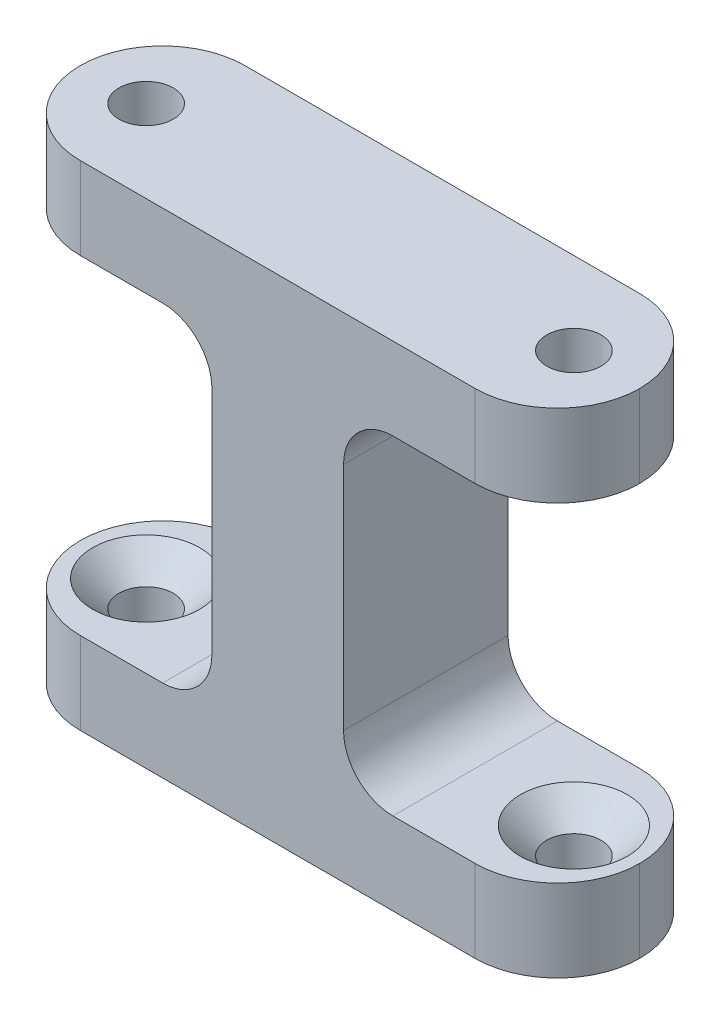
ISO-10303-21;
HEADER;
FILE_DESCRIPTION(('STEP AP214'),'2;1');
FILE_NAME('part.step','',(''),(''),'','','');
FILE_SCHEMA(('AUTOMOTIVE_DESIGN { 1 0 10303 214 1 1 1 1 }'));
ENDSEC;
DATA;
#1=APPLICATION_CONTEXT('core data for automotive mechanical design processes');
#2=APPLICATION_PROTOCOL_DEFINITION('international standard','automotive_design',2000,#1);
#3=PRODUCT_CONTEXT('',#1,'mechanical');
#4=PRODUCT('Part','Part','',(#3));
#5=PRODUCT_RELATED_PRODUCT_CATEGORY('part','',(#4));
#6=PRODUCT_DEFINITION_FORMATION('','',#4);
#7=PRODUCT_DEFINITION_CONTEXT('part definition',#1,'design');
#8=PRODUCT_DEFINITION('design','',#6,#7);
#9=PRODUCT_DEFINITION_SHAPE('','',#8);
#10=(LENGTH_UNIT() NAMED_UNIT(*) SI_UNIT(.MILLI.,.METRE.));
#11=(NAMED_UNIT(*) PLANE_ANGLE_UNIT() SI_UNIT($,.RADIAN.));
#12=(NAMED_UNIT(*) SI_UNIT($,.STERADIAN.) SOLID_ANGLE_UNIT());
#13=UNCERTAINTY_MEASURE_WITH_UNIT(LENGTH_MEASURE(1.E-05),#10,'distance_accuracy_value','');
#14=(GEOMETRIC_REPRESENTATION_CONTEXT(3) GLOBAL_UNCERTAINTY_ASSIGNED_CONTEXT((#13)) GLOBAL_UNIT_ASSIGNED_CONTEXT((#10,
#11,#12)) REPRESENTATION_CONTEXT('',''));
#15=CARTESIAN_POINT('',(0.,0.,0.));
#16=DIRECTION('',(0.,0.,1.));
#17=DIRECTION('',(1.,0.,0.));
#18=AXIS2_PLACEMENT_3D('',#15,#16,#17);
#19=CARTESIAN_POINT('',(-34.,0.,10.));
#20=DIRECTION('',(0.,1.,0.));
#21=DIRECTION('',(0.,0.,1.));
#22=AXIS2_PLACEMENT_3D('',#19,#20,#21);
#23=PLANE('',#22);
#24=CARTESIAN_POINT('',(-30.,0.,5.00000000000001));
#25=DIRECTION('',(0.,1.,0.));
#26=DIRECTION('',(-1.,0.,0.));
#27=AXIS2_PLACEMENT_3D('',#24,#25,#26);
#28=CIRCLE('',#27,1.65);
#29=CARTESIAN_POINT('',(-31.65,0.,5.00000000000001));
#30=VERTEX_POINT('',#29);
#31=EDGE_CURVE('E384',#30,#30,#28,.T.);
#32=ORIENTED_EDGE('',*,*,#31,.T.);
#33=EDGE_LOOP('',(#32));
#34=FACE_BOUND('',#33,.T.);
#35=CARTESIAN_POINT('',(-4.,0.,5.00000000000001));
#36=DIRECTION('',(0.,1.,0.));
#37=DIRECTION('',(-1.,0.,0.));
#38=AXIS2_PLACEMENT_3D('',#35,#36,#37);
#39=CIRCLE('',#38,1.65);
#40=CARTESIAN_POINT('',(-5.65,0.,5.00000000000001));
#41=VERTEX_POINT('',#40);
#42=EDGE_CURVE('E318',#41,#41,#39,.T.);
#43=ORIENTED_EDGE('',*,*,#42,.T.);
#44=EDGE_LOOP('',(#43));
#45=FACE_BOUND('',#44,.T.);
#46=CARTESIAN_POINT('',(-29.,0.,5.));
#47=DIRECTION('',(0.,1.,0.));
#48=DIRECTION('',(0.,0.,1.));
#49=AXIS2_PLACEMENT_3D('',#46,#47,#48);
#50=CIRCLE('',#49,5.);
#51=CARTESIAN_POINT('',(-29.,0.,10.));
#52=VERTEX_POINT('',#51);
#53=CARTESIAN_POINT('',(-34.,0.,5.));
#54=VERTEX_POINT('',#53);
#55=EDGE_CURVE('E273',#52,#54,#50,.F.);
#56=ORIENTED_EDGE('',*,*,#55,.T.);
#57=CARTESIAN_POINT('',(-29.,0.,5.));
#58=DIRECTION('',(0.,1.,0.));
#59=DIRECTION('',(0.,0.,1.));
#60=AXIS2_PLACEMENT_3D('',#57,#58,#59);
#61=CIRCLE('',#60,5.);
#62=CARTESIAN_POINT('',(-29.,0.,0.));
#63=VERTEX_POINT('',#62);
#64=EDGE_CURVE('E275',#54,#63,#61,.F.);
#65=ORIENTED_EDGE('',*,*,#64,.T.);
#66=DIRECTION('',(1.,0.,0.));
#67=VECTOR('',#66,1.);
#68=CARTESIAN_POINT('',(-34.,0.,0.));
#69=LINE('',#68,#67);
#70=CARTESIAN_POINT('',(-5.,0.,0.));
#71=VERTEX_POINT('',#70);
#72=EDGE_CURVE('E355',#63,#71,#69,.T.);
#73=ORIENTED_EDGE('',*,*,#72,.T.);
#74=CARTESIAN_POINT('',(-5.,0.,5.));
#75=DIRECTION('',(0.,1.,0.));
#76=DIRECTION('',(0.,0.,1.));
#77=AXIS2_PLACEMENT_3D('',#74,#75,#76);
#78=CIRCLE('',#77,5.);
#79=CARTESIAN_POINT('',(0.,0.,5.));
#80=VERTEX_POINT('',#79);
#81=EDGE_CURVE('E269',#71,#80,#78,.F.);
#82=ORIENTED_EDGE('',*,*,#81,.T.);
#83=CARTESIAN_POINT('',(-5.,0.,5.));
#84=DIRECTION('',(0.,1.,0.));
#85=DIRECTION('',(0.,0.,1.));
#86=AXIS2_PLACEMENT_3D('',#83,#84,#85);
#87=CIRCLE('',#86,5.);
#88=CARTESIAN_POINT('',(-5.,0.,10.));
#89=VERTEX_POINT('',#88);
#90=EDGE_CURVE('E271',#80,#89,#87,.F.);
#91=ORIENTED_EDGE('',*,*,#90,.T.);
#92=DIRECTION('',(1.,0.,0.));
#93=VECTOR('',#92,1.);
#94=CARTESIAN_POINT('',(-34.,0.,10.));
#95=LINE('',#94,#93);
#96=EDGE_CURVE('E220',#52,#89,#95,.T.);
#97=ORIENTED_EDGE('',*,*,#96,.F.);
#98=EDGE_LOOP('',(#56,#65,#73,#82,#91,#97));
#99=FACE_BOUND('',#98,.T.);
#100=ADVANCED_FACE('F38',(#34,#45,#99),#23,.F.);
#101=CARTESIAN_POINT('',(0.,5.00000000000001,10.));
#102=DIRECTION('',(0.,-1.,0.));
#103=DIRECTION('',(1.,0.,0.));
#104=AXIS2_PLACEMENT_3D('',#101,#102,#103);
#105=PLANE('',#104);
#106=CARTESIAN_POINT('',(-4.,5.00000000000001,5.00000000000001));
#107=DIRECTION('',(0.,-1.,0.));
#108=DIRECTION('',(1.,0.,0.));
#109=AXIS2_PLACEMENT_3D('',#106,#107,#108);
#110=CIRCLE('',#109,3.25);
#111=CARTESIAN_POINT('',(-0.75,5.00000000000001,5.00000000000001));
#112=VERTEX_POINT('',#111);
#113=EDGE_CURVE('E233',#112,#112,#110,.T.);
#114=ORIENTED_EDGE('',*,*,#113,.T.);
#115=EDGE_LOOP('',(#114));
#116=FACE_BOUND('',#115,.T.);
#117=DIRECTION('',(-1.,0.,0.));
#118=VECTOR('',#117,1.);
#119=CARTESIAN_POINT('',(0.,5.00000000000001,10.));
#120=LINE('',#119,#118);
#121=CARTESIAN_POINT('',(-5.,5.,10.));
#122=VERTEX_POINT('',#121);
#123=CARTESIAN_POINT('',(-10.,5.,10.));
#124=VERTEX_POINT('',#123);
#125=EDGE_CURVE('E370',#122,#124,#120,.T.);
#126=ORIENTED_EDGE('',*,*,#125,.F.);
#127=CARTESIAN_POINT('',(-5.,5.,5.));
#128=DIRECTION('',(0.,-1.,0.));
#129=DIRECTION('',(1.,0.,0.));
#130=AXIS2_PLACEMENT_3D('',#127,#128,#129);
#131=CIRCLE('',#130,5.);
#132=CARTESIAN_POINT('',(0.,5.00000000000001,5.));
#133=VERTEX_POINT('',#132);
#134=EDGE_CURVE('E301',#122,#133,#131,.F.);
#135=ORIENTED_EDGE('',*,*,#134,.T.);
#136=CARTESIAN_POINT('',(-5.,5.,5.));
#137=DIRECTION('',(0.,-1.,0.));
#138=DIRECTION('',(1.,0.,0.));
#139=AXIS2_PLACEMENT_3D('',#136,#137,#138);
#140=CIRCLE('',#139,5.);
#141=CARTESIAN_POINT('',(-5.,5.,0.));
#142=VERTEX_POINT('',#141);
#143=EDGE_CURVE('E299',#133,#142,#140,.F.);
#144=ORIENTED_EDGE('',*,*,#143,.T.);
#145=DIRECTION('',(-1.,0.,0.));
#146=VECTOR('',#145,1.);
#147=CARTESIAN_POINT('',(0.,5.00000000000001,0.));
#148=LINE('',#147,#146);
#149=CARTESIAN_POINT('',(-10.,5.,0.));
#150=VERTEX_POINT('',#149);
#151=EDGE_CURVE('E209',#142,#150,#148,.T.);
#152=ORIENTED_EDGE('',*,*,#151,.T.);
#153=DIRECTION('',(0.,0.,-1.));
#154=VECTOR('',#153,1.);
#155=CARTESIAN_POINT('',(-10.,5.,10.));
#156=LINE('',#155,#154);
#157=EDGE_CURVE('E187',#150,#124,#156,.F.);
#158=ORIENTED_EDGE('',*,*,#157,.T.);
#159=EDGE_LOOP('',(#126,#135,#144,#152,#158));
#160=FACE_BOUND('',#159,.T.);
#161=ADVANCED_FACE('F360',(#116,#160),#105,.F.);
#162=CARTESIAN_POINT('',(-13.,5.,10.));
#163=DIRECTION('',(-1.,0.,0.));
#164=DIRECTION('',(0.,0.,1.));
#165=AXIS2_PLACEMENT_3D('',#162,#163,#164);
#166=PLANE('',#165);
#167=DIRECTION('',(0.,1.,0.));
#168=VECTOR('',#167,1.);
#169=CARTESIAN_POINT('',(-13.,5.,0.));
#170=LINE('',#169,#168);
#171=CARTESIAN_POINT('',(-13.,8.,0.));
#172=VERTEX_POINT('',#171);
#173=CARTESIAN_POINT('',(-13.,22.,0.));
#174=VERTEX_POINT('',#173);
#175=EDGE_CURVE('E204',#172,#174,#170,.T.);
#176=ORIENTED_EDGE('',*,*,#175,.T.);
#177=DIRECTION('',(0.,0.,-1.));
#178=VECTOR('',#177,1.);
#179=CARTESIAN_POINT('',(-13.,22.,10.));
#180=LINE('',#179,#178);
#181=CARTESIAN_POINT('',(-13.,22.,10.));
#182=VERTEX_POINT('',#181);
#183=EDGE_CURVE('E181',#174,#182,#180,.F.);
#184=ORIENTED_EDGE('',*,*,#183,.T.);
#185=DIRECTION('',(0.,1.,0.));
#186=VECTOR('',#185,1.);
#187=CARTESIAN_POINT('',(-13.,5.,10.));
#188=LINE('',#187,#186);
#189=CARTESIAN_POINT('',(-13.,8.,10.));
#190=VERTEX_POINT('',#189);
#191=EDGE_CURVE('E348',#190,#182,#188,.T.);
#192=ORIENTED_EDGE('',*,*,#191,.F.);
#193=DIRECTION('',(0.,0.,-1.));
#194=VECTOR('',#193,1.);
#195=CARTESIAN_POINT('',(-13.,8.,0.));
#196=LINE('',#195,#194);
#197=EDGE_CURVE('E194',#190,#172,#196,.T.);
#198=ORIENTED_EDGE('',*,*,#197,.T.);
#199=EDGE_LOOP('',(#176,#184,#192,#198));
#200=FACE_BOUND('',#199,.T.);
#201=ADVANCED_FACE('F372',(#200),#166,.F.);
#202=CARTESIAN_POINT('',(-13.,25.,10.));
#203=DIRECTION('',(0.,1.,0.));
#204=DIRECTION('',(-1.,0.,0.));
#205=AXIS2_PLACEMENT_3D('',#202,#203,#204);
#206=PLANE('',#205);
#207=CARTESIAN_POINT('',(-4.,25.,5.00000000000001));
#208=DIRECTION('',(0.,1.,0.));
#209=DIRECTION('',(-1.,0.,0.));
#210=AXIS2_PLACEMENT_3D('',#207,#208,#209);
#211=CIRCLE('',#210,1.65);
#212=CARTESIAN_POINT('',(-5.65,25.,5.00000000000001));
#213=VERTEX_POINT('',#212);
#214=EDGE_CURVE('E224',#213,#213,#211,.T.);
#215=ORIENTED_EDGE('',*,*,#214,.T.);
#216=EDGE_LOOP('',(#215));
#217=FACE_BOUND('',#216,.T.);
#218=DIRECTION('',(1.,0.,0.));
#219=VECTOR('',#218,1.);
#220=CARTESIAN_POINT('',(-13.,25.,0.));
#221=LINE('',#220,#219);
#222=CARTESIAN_POINT('',(-10.,25.,0.));
#223=VERTEX_POINT('',#222);
#224=CARTESIAN_POINT('',(-5.,25.,0.));
#225=VERTEX_POINT('',#224);
#226=EDGE_CURVE('E191',#223,#225,#221,.T.);
#227=ORIENTED_EDGE('',*,*,#226,.T.);
#228=CARTESIAN_POINT('',(-5.,25.,5.));
#229=DIRECTION('',(0.,1.,0.));
#230=DIRECTION('',(-1.,0.,0.));
#231=AXIS2_PLACEMENT_3D('',#228,#229,#230);
#232=CIRCLE('',#231,5.);
#233=CARTESIAN_POINT('',(0.,25.,5.));
#234=VERTEX_POINT('',#233);
#235=EDGE_CURVE('E61',#225,#234,#232,.F.);
#236=ORIENTED_EDGE('',*,*,#235,.T.);
#237=CARTESIAN_POINT('',(-5.,25.,5.));
#238=DIRECTION('',(0.,1.,0.));
#239=DIRECTION('',(-1.,0.,0.));
#240=AXIS2_PLACEMENT_3D('',#237,#238,#239);
#241=CIRCLE('',#240,5.);
#242=CARTESIAN_POINT('',(-5.,25.,10.));
#243=VERTEX_POINT('',#242);
#244=EDGE_CURVE('E311',#234,#243,#241,.F.);
#245=ORIENTED_EDGE('',*,*,#244,.T.);
#246=DIRECTION('',(1.,0.,0.));
#247=VECTOR('',#246,1.);
#248=CARTESIAN_POINT('',(-13.,25.,10.));
#249=LINE('',#248,#247);
#250=CARTESIAN_POINT('',(-10.,25.,10.));
#251=VERTEX_POINT('',#250);
#252=EDGE_CURVE('E193',#251,#243,#249,.T.);
#253=ORIENTED_EDGE('',*,*,#252,.F.);
#254=DIRECTION('',(0.,0.,-1.));
#255=VECTOR('',#254,1.);
#256=CARTESIAN_POINT('',(-10.,25.,0.));
#257=LINE('',#256,#255);
#258=EDGE_CURVE('E180',#251,#223,#257,.T.);
#259=ORIENTED_EDGE('',*,*,#258,.T.);
#260=EDGE_LOOP('',(#227,#236,#245,#253,#259));
#261=FACE_BOUND('',#260,.T.);
#262=ADVANCED_FACE('F190',(#217,#261),#206,.F.);
#263=CARTESIAN_POINT('',(0.,30.,10.));
#264=DIRECTION('',(0.,-1.,0.));
#265=DIRECTION('',(1.,0.,0.));
#266=AXIS2_PLACEMENT_3D('',#263,#264,#265);
#267=PLANE('',#266);
#268=CARTESIAN_POINT('',(-30.,30.,5.00000000000001));
#269=DIRECTION('',(0.,-1.,0.));
#270=DIRECTION('',(1.,0.,0.));
#271=AXIS2_PLACEMENT_3D('',#268,#269,#270);
#272=CIRCLE('',#271,1.65);
#273=CARTESIAN_POINT('',(-28.35,30.,5.00000000000001));
#274=VERTEX_POINT('',#273);
#275=EDGE_CURVE('E225',#274,#274,#272,.T.);
#276=ORIENTED_EDGE('',*,*,#275,.T.);
#277=EDGE_LOOP('',(#276));
#278=FACE_BOUND('',#277,.T.);
#279=CARTESIAN_POINT('',(-4.,30.,5.00000000000001));
#280=DIRECTION('',(0.,-1.,0.));
#281=DIRECTION('',(1.,0.,0.));
#282=AXIS2_PLACEMENT_3D('',#279,#280,#281);
#283=CIRCLE('',#282,1.65);
#284=CARTESIAN_POINT('',(-2.35,30.,5.00000000000001));
#285=VERTEX_POINT('',#284);
#286=EDGE_CURVE('E221',#285,#285,#283,.T.);
#287=ORIENTED_EDGE('',*,*,#286,.T.);
#288=EDGE_LOOP('',(#287));
#289=FACE_BOUND('',#288,.T.);
#290=CARTESIAN_POINT('',(-5.,30.,5.));
#291=DIRECTION('',(0.,-1.,0.));
#292=DIRECTION('',(1.,0.,0.));
#293=AXIS2_PLACEMENT_3D('',#290,#291,#292);
#294=CIRCLE('',#293,5.);
#295=CARTESIAN_POINT('',(-5.,30.,10.));
#296=VERTEX_POINT('',#295);
#297=CARTESIAN_POINT('',(0.,30.,5.));
#298=VERTEX_POINT('',#297);
#299=EDGE_CURVE('E307',#296,#298,#294,.F.);
#300=ORIENTED_EDGE('',*,*,#299,.T.);
#301=CARTESIAN_POINT('',(-5.,30.,5.));
#302=DIRECTION('',(0.,-1.,0.));
#303=DIRECTION('',(1.,0.,0.));
#304=AXIS2_PLACEMENT_3D('',#301,#302,#303);
#305=CIRCLE('',#304,5.);
#306=CARTESIAN_POINT('',(-5.,30.,0.));
#307=VERTEX_POINT('',#306);
#308=EDGE_CURVE('E309',#298,#307,#305,.F.);
#309=ORIENTED_EDGE('',*,*,#308,.T.);
#310=DIRECTION('',(-1.,0.,0.));
#311=VECTOR('',#310,1.);
#312=CARTESIAN_POINT('',(0.,30.,0.));
#313=LINE('',#312,#311);
#314=CARTESIAN_POINT('',(-29.,30.,0.));
#315=VERTEX_POINT('',#314);
#316=EDGE_CURVE('E203',#307,#315,#313,.T.);
#317=ORIENTED_EDGE('',*,*,#316,.T.);
#318=CARTESIAN_POINT('',(-29.,30.,5.));
#319=DIRECTION('',(0.,-1.,0.));
#320=DIRECTION('',(1.,0.,0.));
#321=AXIS2_PLACEMENT_3D('',#318,#319,#320);
#322=CIRCLE('',#321,5.);
#323=CARTESIAN_POINT('',(-34.,30.,5.));
#324=VERTEX_POINT('',#323);
#325=EDGE_CURVE('E305',#315,#324,#322,.F.);
#326=ORIENTED_EDGE('',*,*,#325,.T.);
#327=CARTESIAN_POINT('',(-29.,30.,5.));
#328=DIRECTION('',(0.,-1.,0.));
#329=DIRECTION('',(1.,0.,0.));
#330=AXIS2_PLACEMENT_3D('',#327,#328,#329);
#331=CIRCLE('',#330,5.);
#332=CARTESIAN_POINT('',(-29.,30.,10.));
#333=VERTEX_POINT('',#332);
#334=EDGE_CURVE('E303',#324,#333,#331,.F.);
#335=ORIENTED_EDGE('',*,*,#334,.T.);
#336=DIRECTION('',(-1.,0.,0.));
#337=VECTOR('',#336,1.);
#338=CARTESIAN_POINT('',(0.,30.,10.));
#339=LINE('',#338,#337);
#340=EDGE_CURVE('E338',#296,#333,#339,.T.);
#341=ORIENTED_EDGE('',*,*,#340,.F.);
#342=EDGE_LOOP('',(#300,#309,#317,#326,#335,#341));
#343=FACE_BOUND('',#342,.T.);
#344=ADVANCED_FACE('F337',(#278,#289,#343),#267,.F.);
#345=CARTESIAN_POINT('',(-34.,25.,10.));
#346=DIRECTION('',(0.,1.,0.));
#347=DIRECTION('',(0.,0.,1.));
#348=AXIS2_PLACEMENT_3D('',#345,#346,#347);
#349=PLANE('',#348);
#350=CARTESIAN_POINT('',(-30.,25.,5.00000000000001));
#351=DIRECTION('',(0.,1.,0.));
#352=DIRECTION('',(0.,0.,1.));
#353=AXIS2_PLACEMENT_3D('',#350,#351,#352);
#354=CIRCLE('',#353,1.65);
#355=CARTESIAN_POINT('',(-30.,25.,6.65000000000001));
#356=VERTEX_POINT('',#355);
#357=EDGE_CURVE('E381',#356,#356,#354,.T.);
#358=ORIENTED_EDGE('',*,*,#357,.T.);
#359=EDGE_LOOP('',(#358));
#360=FACE_BOUND('',#359,.T.);
#361=CARTESIAN_POINT('',(-29.,25.,5.));
#362=DIRECTION('',(0.,1.,0.));
#363=DIRECTION('',(0.,0.,1.));
#364=AXIS2_PLACEMENT_3D('',#361,#362,#363);
#365=CIRCLE('',#364,5.);
#366=CARTESIAN_POINT('',(-29.,25.,10.));
#367=VERTEX_POINT('',#366);
#368=CARTESIAN_POINT('',(-34.,25.,5.));
#369=VERTEX_POINT('',#368);
#370=EDGE_CURVE('E47',#367,#369,#365,.F.);
#371=ORIENTED_EDGE('',*,*,#370,.T.);
#372=CARTESIAN_POINT('',(-29.,25.,5.));
#373=DIRECTION('',(0.,1.,0.));
#374=DIRECTION('',(0.,0.,1.));
#375=AXIS2_PLACEMENT_3D('',#372,#373,#374);
#376=CIRCLE('',#375,5.);
#377=CARTESIAN_POINT('',(-29.,25.,0.));
#378=VERTEX_POINT('',#377);
#379=EDGE_CURVE('E11',#369,#378,#376,.F.);
#380=ORIENTED_EDGE('',*,*,#379,.T.);
#381=DIRECTION('',(1.,0.,0.));
#382=VECTOR('',#381,1.);
#383=CARTESIAN_POINT('',(-34.,25.,0.));
#384=LINE('',#383,#382);
#385=CARTESIAN_POINT('',(-24.,25.,0.));
#386=VERTEX_POINT('',#385);
#387=EDGE_CURVE('E207',#378,#386,#384,.T.);
#388=ORIENTED_EDGE('',*,*,#387,.T.);
#389=DIRECTION('',(0.,0.,-1.));
#390=VECTOR('',#389,1.);
#391=CARTESIAN_POINT('',(-24.,25.,10.));
#392=LINE('',#391,#390);
#393=CARTESIAN_POINT('',(-24.,25.,10.));
#394=VERTEX_POINT('',#393);
#395=EDGE_CURVE('E246',#386,#394,#392,.F.);
#396=ORIENTED_EDGE('',*,*,#395,.T.);
#397=DIRECTION('',(1.,0.,0.));
#398=VECTOR('',#397,1.);
#399=CARTESIAN_POINT('',(-34.,25.,10.));
#400=LINE('',#399,#398);
#401=EDGE_CURVE('E344',#367,#394,#400,.T.);
#402=ORIENTED_EDGE('',*,*,#401,.F.);
#403=EDGE_LOOP('',(#371,#380,#388,#396,#402));
#404=FACE_BOUND('',#403,.T.);
#405=ADVANCED_FACE('F605',(#360,#404),#349,.F.);
#406=CARTESIAN_POINT('',(-21.,25.,10.));
#407=DIRECTION('',(1.,0.,0.));
#408=DIRECTION('',(0.,1.,0.));
#409=AXIS2_PLACEMENT_3D('',#406,#407,#408);
#410=PLANE('',#409);
#411=DIRECTION('',(0.,-1.,0.));
#412=VECTOR('',#411,1.);
#413=CARTESIAN_POINT('',(-21.,25.,10.));
#414=LINE('',#413,#412);
#415=CARTESIAN_POINT('',(-21.,22.,10.));
#416=VERTEX_POINT('',#415);
#417=CARTESIAN_POINT('',(-21.,8.,10.));
#418=VERTEX_POINT('',#417);
#419=EDGE_CURVE('E346',#416,#418,#414,.T.);
#420=ORIENTED_EDGE('',*,*,#419,.F.);
#421=DIRECTION('',(0.,0.,-1.));
#422=VECTOR('',#421,1.);
#423=CARTESIAN_POINT('',(-21.,22.,0.));
#424=LINE('',#423,#422);
#425=CARTESIAN_POINT('',(-21.,22.,0.));
#426=VERTEX_POINT('',#425);
#427=EDGE_CURVE('E243',#416,#426,#424,.T.);
#428=ORIENTED_EDGE('',*,*,#427,.T.);
#429=DIRECTION('',(0.,-1.,0.));
#430=VECTOR('',#429,1.);
#431=CARTESIAN_POINT('',(-21.,25.,0.));
#432=LINE('',#431,#430);
#433=CARTESIAN_POINT('',(-21.,8.,0.));
#434=VERTEX_POINT('',#433);
#435=EDGE_CURVE('E214',#426,#434,#432,.T.);
#436=ORIENTED_EDGE('',*,*,#435,.T.);
#437=DIRECTION('',(0.,0.,-1.));
#438=VECTOR('',#437,1.);
#439=CARTESIAN_POINT('',(-21.,8.,10.));
#440=LINE('',#439,#438);
#441=EDGE_CURVE('E241',#434,#418,#440,.F.);
#442=ORIENTED_EDGE('',*,*,#441,.T.);
#443=EDGE_LOOP('',(#420,#428,#436,#442));
#444=FACE_BOUND('',#443,.T.);
#445=ADVANCED_FACE('F596',(#444),#410,.F.);
#446=CARTESIAN_POINT('',(-21.,5.,10.));
#447=DIRECTION('',(0.,-1.,0.));
#448=DIRECTION('',(1.,0.,0.));
#449=AXIS2_PLACEMENT_3D('',#446,#447,#448);
#450=PLANE('',#449);
#451=CARTESIAN_POINT('',(-30.,5.,5.00000000000001));
#452=DIRECTION('',(0.,-1.,0.));
#453=DIRECTION('',(1.,0.,0.));
#454=AXIS2_PLACEMENT_3D('',#451,#452,#453);
#455=CIRCLE('',#454,3.25);
#456=CARTESIAN_POINT('',(-26.75,5.,5.00000000000001));
#457=VERTEX_POINT('',#456);
#458=EDGE_CURVE('E226',#457,#457,#455,.T.);
#459=ORIENTED_EDGE('',*,*,#458,.T.);
#460=EDGE_LOOP('',(#459));
#461=FACE_BOUND('',#460,.T.);
#462=DIRECTION('',(-1.,0.,0.));
#463=VECTOR('',#462,1.);
#464=CARTESIAN_POINT('',(-21.,5.,0.));
#465=LINE('',#464,#463);
#466=CARTESIAN_POINT('',(-24.,5.,0.));
#467=VERTEX_POINT('',#466);
#468=CARTESIAN_POINT('',(-29.,5.,0.));
#469=VERTEX_POINT('',#468);
#470=EDGE_CURVE('E217',#467,#469,#465,.T.);
#471=ORIENTED_EDGE('',*,*,#470,.T.);
#472=CARTESIAN_POINT('',(-29.,5.,5.));
#473=DIRECTION('',(0.,-1.,0.));
#474=DIRECTION('',(1.,0.,0.));
#475=AXIS2_PLACEMENT_3D('',#472,#473,#474);
#476=CIRCLE('',#475,5.);
#477=CARTESIAN_POINT('',(-34.,5.,5.));
#478=VERTEX_POINT('',#477);
#479=EDGE_CURVE('E288',#469,#478,#476,.F.);
#480=ORIENTED_EDGE('',*,*,#479,.T.);
#481=CARTESIAN_POINT('',(-29.,5.,5.));
#482=DIRECTION('',(0.,-1.,0.));
#483=DIRECTION('',(1.,0.,0.));
#484=AXIS2_PLACEMENT_3D('',#481,#482,#483);
#485=CIRCLE('',#484,5.);
#486=CARTESIAN_POINT('',(-29.,5.,10.));
#487=VERTEX_POINT('',#486);
#488=EDGE_CURVE('E286',#478,#487,#485,.F.);
#489=ORIENTED_EDGE('',*,*,#488,.T.);
#490=DIRECTION('',(-1.,0.,0.));
#491=VECTOR('',#490,1.);
#492=CARTESIAN_POINT('',(-21.,5.,10.));
#493=LINE('',#492,#491);
#494=CARTESIAN_POINT('',(-24.,5.,10.));
#495=VERTEX_POINT('',#494);
#496=EDGE_CURVE('E230',#495,#487,#493,.T.);
#497=ORIENTED_EDGE('',*,*,#496,.F.);
#498=DIRECTION('',(0.,0.,-1.));
#499=VECTOR('',#498,1.);
#500=CARTESIAN_POINT('',(-24.,5.,0.));
#501=LINE('',#500,#499);
#502=EDGE_CURVE('E249',#495,#467,#501,.T.);
#503=ORIENTED_EDGE('',*,*,#502,.T.);
#504=EDGE_LOOP('',(#471,#480,#489,#497,#503));
#505=FACE_BOUND('',#504,.T.);
#506=ADVANCED_FACE('F588',(#461,#505),#450,.F.);
#507=CARTESIAN_POINT('',(0.,0.,10.));
#508=DIRECTION('',(0.,0.,1.));
#509=DIRECTION('',(1.,0.,0.));
#510=AXIS2_PLACEMENT_3D('',#507,#508,#509);
#511=PLANE('',#510);
#512=ORIENTED_EDGE('',*,*,#496,.T.);
#513=DIRECTION('',(0.,-1.,0.));
#514=VECTOR('',#513,1.);
#515=CARTESIAN_POINT('',(-29.,0.,10.));
#516=LINE('',#515,#514);
#517=EDGE_CURVE('E297',#487,#52,#516,.T.);
#518=ORIENTED_EDGE('',*,*,#517,.T.);
#519=ORIENTED_EDGE('',*,*,#96,.T.);
#520=DIRECTION('',(0.,1.,0.));
#521=VECTOR('',#520,1.);
#522=CARTESIAN_POINT('',(-5.,5.00000000000001,10.));
#523=LINE('',#522,#521);
#524=EDGE_CURVE('E294',#89,#122,#523,.T.);
#525=ORIENTED_EDGE('',*,*,#524,.T.);
#526=ORIENTED_EDGE('',*,*,#125,.T.);
#527=CARTESIAN_POINT('',(-10.,8.,10.));
#528=DIRECTION('',(0.,0.,1.));
#529=DIRECTION('',(1.,0.,0.));
#530=AXIS2_PLACEMENT_3D('',#527,#528,#529);
#531=CIRCLE('',#530,3.);
#532=EDGE_CURVE('E267',#124,#190,#531,.F.);
#533=ORIENTED_EDGE('',*,*,#532,.T.);
#534=ORIENTED_EDGE('',*,*,#191,.T.);
#535=CARTESIAN_POINT('',(-10.,22.,10.));
#536=DIRECTION('',(0.,0.,1.));
#537=DIRECTION('',(1.,0.,0.));
#538=AXIS2_PLACEMENT_3D('',#535,#536,#537);
#539=CIRCLE('',#538,3.);
#540=EDGE_CURVE('E186',#182,#251,#539,.F.);
#541=ORIENTED_EDGE('',*,*,#540,.T.);
#542=ORIENTED_EDGE('',*,*,#252,.T.);
#543=DIRECTION('',(0.,1.,0.));
#544=VECTOR('',#543,1.);
#545=CARTESIAN_POINT('',(-5.,30.,10.));
#546=LINE('',#545,#544);
#547=EDGE_CURVE('E292',#243,#296,#546,.T.);
#548=ORIENTED_EDGE('',*,*,#547,.T.);
#549=ORIENTED_EDGE('',*,*,#340,.T.);
#550=DIRECTION('',(0.,-1.,0.));
#551=VECTOR('',#550,1.);
#552=CARTESIAN_POINT('',(-29.,25.,10.));
#553=LINE('',#552,#551);
#554=EDGE_CURVE('E290',#333,#367,#553,.T.);
#555=ORIENTED_EDGE('',*,*,#554,.T.);
#556=ORIENTED_EDGE('',*,*,#401,.T.);
#557=CARTESIAN_POINT('',(-24.,22.,10.));
#558=DIRECTION('',(0.,0.,1.));
#559=DIRECTION('',(1.,0.,0.));
#560=AXIS2_PLACEMENT_3D('',#557,#558,#559);
#561=CIRCLE('',#560,3.);
#562=EDGE_CURVE('E258',#394,#416,#561,.F.);
#563=ORIENTED_EDGE('',*,*,#562,.T.);
#564=ORIENTED_EDGE('',*,*,#419,.T.);
#565=CARTESIAN_POINT('',(-24.,8.,10.));
#566=DIRECTION('',(0.,0.,1.));
#567=DIRECTION('',(1.,0.,0.));
#568=AXIS2_PLACEMENT_3D('',#565,#566,#567);
#569=CIRCLE('',#568,3.);
#570=EDGE_CURVE('E262',#418,#495,#569,.F.);
#571=ORIENTED_EDGE('',*,*,#570,.T.);
#572=EDGE_LOOP('',(#512,#518,#519,#525,#526,#533,#534,#541,#542,#548,#549,#555,#556,#563,#564,#571));
#573=FACE_BOUND('',#572,.T.);
#574=ADVANCED_FACE('F342',(#573),#511,.T.);
#575=CARTESIAN_POINT('',(0.,0.,0.));
#576=DIRECTION('',(0.,0.,1.));
#577=DIRECTION('',(1.,0.,0.));
#578=AXIS2_PLACEMENT_3D('',#575,#576,#577);
#579=PLANE('',#578);
#580=ORIENTED_EDGE('',*,*,#72,.F.);
#581=DIRECTION('',(0.,-1.,0.));
#582=VECTOR('',#581,1.);
#583=CARTESIAN_POINT('',(-29.,0.,0.));
#584=LINE('',#583,#582);
#585=EDGE_CURVE('E283',#63,#469,#584,.F.);
#586=ORIENTED_EDGE('',*,*,#585,.T.);
#587=ORIENTED_EDGE('',*,*,#470,.F.);
#588=CARTESIAN_POINT('',(-24.,8.,0.));
#589=DIRECTION('',(0.,0.,1.));
#590=DIRECTION('',(1.,0.,0.));
#591=AXIS2_PLACEMENT_3D('',#588,#589,#590);
#592=CIRCLE('',#591,3.);
#593=EDGE_CURVE('E260',#467,#434,#592,.T.);
#594=ORIENTED_EDGE('',*,*,#593,.T.);
#595=ORIENTED_EDGE('',*,*,#435,.F.);
#596=CARTESIAN_POINT('',(-24.,22.,0.));
#597=DIRECTION('',(0.,0.,1.));
#598=DIRECTION('',(1.,0.,0.));
#599=AXIS2_PLACEMENT_3D('',#596,#597,#598);
#600=CIRCLE('',#599,3.);
#601=EDGE_CURVE('E255',#426,#386,#600,.T.);
#602=ORIENTED_EDGE('',*,*,#601,.T.);
#603=ORIENTED_EDGE('',*,*,#387,.F.);
#604=DIRECTION('',(0.,-1.,0.));
#605=VECTOR('',#604,1.);
#606=CARTESIAN_POINT('',(-29.,0.,0.));
#607=LINE('',#606,#605);
#608=EDGE_CURVE('E277',#378,#315,#607,.F.);
#609=ORIENTED_EDGE('',*,*,#608,.T.);
#610=ORIENTED_EDGE('',*,*,#316,.F.);
#611=DIRECTION('',(0.,1.,0.));
#612=VECTOR('',#611,1.);
#613=CARTESIAN_POINT('',(-5.,0.,0.));
#614=LINE('',#613,#612);
#615=EDGE_CURVE('E202',#307,#225,#614,.F.);
#616=ORIENTED_EDGE('',*,*,#615,.T.);
#617=ORIENTED_EDGE('',*,*,#226,.F.);
#618=CARTESIAN_POINT('',(-10.,22.,0.));
#619=DIRECTION('',(0.,0.,1.));
#620=DIRECTION('',(1.,0.,0.));
#621=AXIS2_PLACEMENT_3D('',#618,#619,#620);
#622=CIRCLE('',#621,3.);
#623=EDGE_CURVE('E176',#223,#174,#622,.T.);
#624=ORIENTED_EDGE('',*,*,#623,.T.);
#625=ORIENTED_EDGE('',*,*,#175,.F.);
#626=CARTESIAN_POINT('',(-10.,8.,0.));
#627=DIRECTION('',(0.,0.,1.));
#628=DIRECTION('',(1.,0.,0.));
#629=AXIS2_PLACEMENT_3D('',#626,#627,#628);
#630=CIRCLE('',#629,3.);
#631=EDGE_CURVE('E264',#172,#150,#630,.T.);
#632=ORIENTED_EDGE('',*,*,#631,.T.);
#633=ORIENTED_EDGE('',*,*,#151,.F.);
#634=DIRECTION('',(0.,1.,0.));
#635=VECTOR('',#634,1.);
#636=CARTESIAN_POINT('',(-5.,0.,0.));
#637=LINE('',#636,#635);
#638=EDGE_CURVE('E281',#142,#71,#637,.F.);
#639=ORIENTED_EDGE('',*,*,#638,.T.);
#640=EDGE_LOOP('',(#580,#586,#587,#594,#595,#602,#603,#609,#610,#616,#617,#624,#625,#632,#633,#639));
#641=FACE_BOUND('',#640,.T.);
#642=ADVANCED_FACE('F199',(#641),#579,.F.);
#643=CARTESIAN_POINT('',(-30.,0.,5.00000000000001));
#644=DIRECTION('',(0.,1.,0.));
#645=DIRECTION('',(-1.,0.,0.));
#646=AXIS2_PLACEMENT_3D('',#643,#644,#645);
#647=CYLINDRICAL_SURFACE('',#646,1.65);
#648=CARTESIAN_POINT('',(-30.,3.39999999999999,5.00000000000001));
#649=DIRECTION('',(0.,-1.,0.));
#650=DIRECTION('',(0.,0.,-1.));
#651=AXIS2_PLACEMENT_3D('',#648,#649,#650);
#652=CIRCLE('',#651,1.65);
#653=CARTESIAN_POINT('',(-30.,3.39999999999999,3.35));
#654=VERTEX_POINT('',#653);
#655=EDGE_CURVE('E229',#654,#654,#652,.F.);
#656=ORIENTED_EDGE('',*,*,#655,.T.);
#657=EDGE_LOOP('',(#656));
#658=FACE_BOUND('',#657,.T.);
#659=ORIENTED_EDGE('',*,*,#31,.F.);
#660=EDGE_LOOP('',(#659));
#661=FACE_BOUND('',#660,.T.);
#662=ADVANCED_FACE('F392',(#658,#661),#647,.F.);
#663=ORIENTED_EDGE('',*,*,#357,.F.);
#664=EDGE_LOOP('',(#663));
#665=FACE_BOUND('',#664,.T.);
#666=ORIENTED_EDGE('',*,*,#275,.F.);
#667=EDGE_LOOP('',(#666));
#668=FACE_BOUND('',#667,.T.);
#669=ADVANCED_FACE('F394',(#665,#668),#647,.F.);
#670=CARTESIAN_POINT('',(-4.,0.,5.00000000000001));
#671=DIRECTION('',(0.,1.,0.));
#672=DIRECTION('',(-1.,0.,0.));
#673=AXIS2_PLACEMENT_3D('',#670,#671,#672);
#674=CYLINDRICAL_SURFACE('',#673,1.65);
#675=ORIENTED_EDGE('',*,*,#286,.F.);
#676=EDGE_LOOP('',(#675));
#677=FACE_BOUND('',#676,.T.);
#678=ORIENTED_EDGE('',*,*,#214,.F.);
#679=EDGE_LOOP('',(#678));
#680=FACE_BOUND('',#679,.T.);
#681=ADVANCED_FACE('F401',(#677,#680),#674,.F.);
#682=CARTESIAN_POINT('',(-4.,3.4,5.00000000000001));
#683=DIRECTION('',(0.,-1.,0.));
#684=DIRECTION('',(0.,0.,-1.));
#685=AXIS2_PLACEMENT_3D('',#682,#683,#684);
#686=CIRCLE('',#685,1.65);
#687=CARTESIAN_POINT('',(-4.,3.4,3.35));
#688=VERTEX_POINT('',#687);
#689=EDGE_CURVE('E195',#688,#688,#686,.F.);
#690=ORIENTED_EDGE('',*,*,#689,.T.);
#691=EDGE_LOOP('',(#690));
#692=FACE_BOUND('',#691,.T.);
#693=ORIENTED_EDGE('',*,*,#42,.F.);
#694=EDGE_LOOP('',(#693));
#695=FACE_BOUND('',#694,.T.);
#696=ADVANCED_FACE('F422',(#692,#695),#674,.F.);
#697=CARTESIAN_POINT('',(-30.,5.,5.00000000000001));
#698=DIRECTION('',(0.,1.,0.));
#699=DIRECTION('',(0.,0.,1.));
#700=AXIS2_PLACEMENT_3D('',#697,#698,#699);
#701=CONICAL_SURFACE('',#700,3.25,0.785398163397444);
#702=ORIENTED_EDGE('',*,*,#655,.F.);
#703=EDGE_LOOP('',(#702));
#704=FACE_BOUND('',#703,.T.);
#705=ORIENTED_EDGE('',*,*,#458,.F.);
#706=EDGE_LOOP('',(#705));
#707=FACE_BOUND('',#706,.T.);
#708=ADVANCED_FACE('F415',(#704,#707),#701,.F.);
#709=CARTESIAN_POINT('',(-4.,5.00000000000001,5.00000000000001));
#710=DIRECTION('',(0.,1.,0.));
#711=DIRECTION('',(0.,0.,1.));
#712=AXIS2_PLACEMENT_3D('',#709,#710,#711);
#713=CONICAL_SURFACE('',#712,3.25,0.785398163397445);
#714=ORIENTED_EDGE('',*,*,#689,.F.);
#715=EDGE_LOOP('',(#714));
#716=FACE_BOUND('',#715,.T.);
#717=ORIENTED_EDGE('',*,*,#113,.F.);
#718=EDGE_LOOP('',(#717));
#719=FACE_BOUND('',#718,.T.);
#720=ADVANCED_FACE('F421',(#716,#719),#713,.F.);
#721=CARTESIAN_POINT('',(-10.,22.,10.));
#722=DIRECTION('',(0.,0.,1.));
#723=DIRECTION('',(1.,0.,0.));
#724=AXIS2_PLACEMENT_3D('',#721,#722,#723);
#725=CYLINDRICAL_SURFACE('',#724,3.);
#726=ORIENTED_EDGE('',*,*,#540,.F.);
#727=ORIENTED_EDGE('',*,*,#183,.F.);
#728=ORIENTED_EDGE('',*,*,#623,.F.);
#729=ORIENTED_EDGE('',*,*,#258,.F.);
#730=EDGE_LOOP('',(#726,#727,#728,#729));
#731=FACE_BOUND('',#730,.T.);
#732=ADVANCED_FACE('F179',(#731),#725,.F.);
#733=CARTESIAN_POINT('',(-24.,22.,10.));
#734=DIRECTION('',(0.,0.,1.));
#735=DIRECTION('',(1.,0.,0.));
#736=AXIS2_PLACEMENT_3D('',#733,#734,#735);
#737=CYLINDRICAL_SURFACE('',#736,3.);
#738=ORIENTED_EDGE('',*,*,#562,.F.);
#739=ORIENTED_EDGE('',*,*,#395,.F.);
#740=ORIENTED_EDGE('',*,*,#601,.F.);
#741=ORIENTED_EDGE('',*,*,#427,.F.);
#742=EDGE_LOOP('',(#738,#739,#740,#741));
#743=FACE_BOUND('',#742,.T.);
#744=ADVANCED_FACE('F431',(#743),#737,.F.);
#745=CARTESIAN_POINT('',(-24.,8.,10.));
#746=DIRECTION('',(0.,0.,1.));
#747=DIRECTION('',(1.,0.,0.));
#748=AXIS2_PLACEMENT_3D('',#745,#746,#747);
#749=CYLINDRICAL_SURFACE('',#748,3.);
#750=ORIENTED_EDGE('',*,*,#570,.F.);
#751=ORIENTED_EDGE('',*,*,#441,.F.);
#752=ORIENTED_EDGE('',*,*,#593,.F.);
#753=ORIENTED_EDGE('',*,*,#502,.F.);
#754=EDGE_LOOP('',(#750,#751,#752,#753));
#755=FACE_BOUND('',#754,.T.);
#756=ADVANCED_FACE('F434',(#755),#749,.F.);
#757=CARTESIAN_POINT('',(-10.,8.,10.));
#758=DIRECTION('',(0.,0.,1.));
#759=DIRECTION('',(1.,0.,0.));
#760=AXIS2_PLACEMENT_3D('',#757,#758,#759);
#761=CYLINDRICAL_SURFACE('',#760,3.);
#762=ORIENTED_EDGE('',*,*,#532,.F.);
#763=ORIENTED_EDGE('',*,*,#157,.F.);
#764=ORIENTED_EDGE('',*,*,#631,.F.);
#765=ORIENTED_EDGE('',*,*,#197,.F.);
#766=EDGE_LOOP('',(#762,#763,#764,#765));
#767=FACE_BOUND('',#766,.T.);
#768=ADVANCED_FACE('F367',(#767),#761,.F.);
#769=CARTESIAN_POINT('',(-29.,0.,5.));
#770=DIRECTION('',(0.,1.,0.));
#771=DIRECTION('',(0.,0.,1.));
#772=AXIS2_PLACEMENT_3D('',#769,#770,#771);
#773=CYLINDRICAL_SURFACE('',#772,5.);
#774=ORIENTED_EDGE('',*,*,#517,.F.);
#775=ORIENTED_EDGE('',*,*,#488,.F.);
#776=DIRECTION('',(0.,-1.,0.));
#777=VECTOR('',#776,1.);
#778=CARTESIAN_POINT('',(-34.,5.,5.));
#779=LINE('',#778,#777);
#780=EDGE_CURVE('E315',#54,#478,#779,.F.);
#781=ORIENTED_EDGE('',*,*,#780,.F.);
#782=ORIENTED_EDGE('',*,*,#55,.F.);
#783=EDGE_LOOP('',(#774,#775,#781,#782));
#784=FACE_BOUND('',#783,.T.);
#785=ADVANCED_FACE('F441',(#784),#773,.T.);
#786=CARTESIAN_POINT('',(-29.,5.,5.));
#787=DIRECTION('',(0.,-1.,0.));
#788=DIRECTION('',(0.,0.,-1.));
#789=AXIS2_PLACEMENT_3D('',#786,#787,#788);
#790=CYLINDRICAL_SURFACE('',#789,5.);
#791=ORIENTED_EDGE('',*,*,#479,.F.);
#792=ORIENTED_EDGE('',*,*,#585,.F.);
#793=ORIENTED_EDGE('',*,*,#64,.F.);
#794=ORIENTED_EDGE('',*,*,#780,.T.);
#795=EDGE_LOOP('',(#791,#792,#793,#794));
#796=FACE_BOUND('',#795,.T.);
#797=ADVANCED_FACE('F442',(#796),#790,.T.);
#798=CARTESIAN_POINT('',(-5.,0.,5.));
#799=DIRECTION('',(0.,1.,0.));
#800=DIRECTION('',(-1.,0.,0.));
#801=AXIS2_PLACEMENT_3D('',#798,#799,#800);
#802=CYLINDRICAL_SURFACE('',#801,5.);
#803=DIRECTION('',(0.,1.,0.));
#804=VECTOR('',#803,1.);
#805=CARTESIAN_POINT('',(0.,0.,5.));
#806=LINE('',#805,#804);
#807=EDGE_CURVE('E319',#80,#133,#806,.T.);
#808=ORIENTED_EDGE('',*,*,#807,.F.);
#809=ORIENTED_EDGE('',*,*,#81,.F.);
#810=ORIENTED_EDGE('',*,*,#638,.F.);
#811=ORIENTED_EDGE('',*,*,#143,.F.);
#812=EDGE_LOOP('',(#808,#809,#810,#811));
#813=FACE_BOUND('',#812,.T.);
#814=ADVANCED_FACE('F445',(#813),#802,.T.);
#815=CARTESIAN_POINT('',(-5.,0.,5.));
#816=DIRECTION('',(0.,-1.,0.));
#817=DIRECTION('',(1.,0.,0.));
#818=AXIS2_PLACEMENT_3D('',#815,#816,#817);
#819=CYLINDRICAL_SURFACE('',#818,5.);
#820=ORIENTED_EDGE('',*,*,#90,.F.);
#821=ORIENTED_EDGE('',*,*,#807,.T.);
#822=ORIENTED_EDGE('',*,*,#134,.F.);
#823=ORIENTED_EDGE('',*,*,#524,.F.);
#824=EDGE_LOOP('',(#820,#821,#822,#823));
#825=FACE_BOUND('',#824,.T.);
#826=ADVANCED_FACE('F450',(#825),#819,.T.);
#827=CARTESIAN_POINT('',(-5.,0.,5.));
#828=DIRECTION('',(0.,-1.,0.));
#829=DIRECTION('',(0.,0.,-1.));
#830=AXIS2_PLACEMENT_3D('',#827,#828,#829);
#831=CYLINDRICAL_SURFACE('',#830,5.);
#832=ORIENTED_EDGE('',*,*,#547,.F.);
#833=ORIENTED_EDGE('',*,*,#244,.F.);
#834=DIRECTION('',(0.,1.,0.));
#835=VECTOR('',#834,1.);
#836=CARTESIAN_POINT('',(0.,25.,5.));
#837=LINE('',#836,#835);
#838=EDGE_CURVE('E321',#298,#234,#837,.F.);
#839=ORIENTED_EDGE('',*,*,#838,.F.);
#840=ORIENTED_EDGE('',*,*,#299,.F.);
#841=EDGE_LOOP('',(#832,#833,#839,#840));
#842=FACE_BOUND('',#841,.T.);
#843=ADVANCED_FACE('F453',(#842),#831,.T.);
#844=CARTESIAN_POINT('',(-5.,25.,5.));
#845=DIRECTION('',(0.,1.,0.));
#846=DIRECTION('',(0.,0.,1.));
#847=AXIS2_PLACEMENT_3D('',#844,#845,#846);
#848=CYLINDRICAL_SURFACE('',#847,5.);
#849=ORIENTED_EDGE('',*,*,#235,.F.);
#850=ORIENTED_EDGE('',*,*,#615,.F.);
#851=ORIENTED_EDGE('',*,*,#308,.F.);
#852=ORIENTED_EDGE('',*,*,#838,.T.);
#853=EDGE_LOOP('',(#849,#850,#851,#852));
#854=FACE_BOUND('',#853,.T.);
#855=ADVANCED_FACE('F458',(#854),#848,.T.);
#856=CARTESIAN_POINT('',(-29.,0.,5.));
#857=DIRECTION('',(0.,1.,0.));
#858=DIRECTION('',(0.,0.,1.));
#859=AXIS2_PLACEMENT_3D('',#856,#857,#858);
#860=CYLINDRICAL_SURFACE('',#859,5.);
#861=ORIENTED_EDGE('',*,*,#554,.F.);
#862=ORIENTED_EDGE('',*,*,#334,.F.);
#863=DIRECTION('',(0.,-1.,0.));
#864=VECTOR('',#863,1.);
#865=CARTESIAN_POINT('',(-34.,30.,5.));
#866=LINE('',#865,#864);
#867=EDGE_CURVE('E42',#369,#324,#866,.F.);
#868=ORIENTED_EDGE('',*,*,#867,.F.);
#869=ORIENTED_EDGE('',*,*,#370,.F.);
#870=EDGE_LOOP('',(#861,#862,#868,#869));
#871=FACE_BOUND('',#870,.T.);
#872=ADVANCED_FACE('F40',(#871),#860,.T.);
#873=CARTESIAN_POINT('',(-29.,30.,5.));
#874=DIRECTION('',(0.,-1.,0.));
#875=DIRECTION('',(0.,0.,-1.));
#876=AXIS2_PLACEMENT_3D('',#873,#874,#875);
#877=CYLINDRICAL_SURFACE('',#876,5.);
#878=ORIENTED_EDGE('',*,*,#325,.F.);
#879=ORIENTED_EDGE('',*,*,#608,.F.);
#880=ORIENTED_EDGE('',*,*,#379,.F.);
#881=ORIENTED_EDGE('',*,*,#867,.T.);
#882=EDGE_LOOP('',(#878,#879,#880,#881));
#883=FACE_BOUND('',#882,.T.);
#884=ADVANCED_FACE('F329',(#883),#877,.T.);
#885=CLOSED_SHELL('',(#100,#161,#201,#262,#344,#405,#445,#506,#574,#642,#662,#669,#681,#696,
#708,#720,#732,#744,#756,#768,#785,#797,#814,#826,#843,#855,#872,#884));
#886=MANIFOLD_SOLID_BREP('B2',#885);
#887=ADVANCED_BREP_SHAPE_REPRESENTATION('',(#18,#886),#14);
#888=SHAPE_DEFINITION_REPRESENTATION(#9,#887);
ENDSEC;
END-ISO-10303-21;
